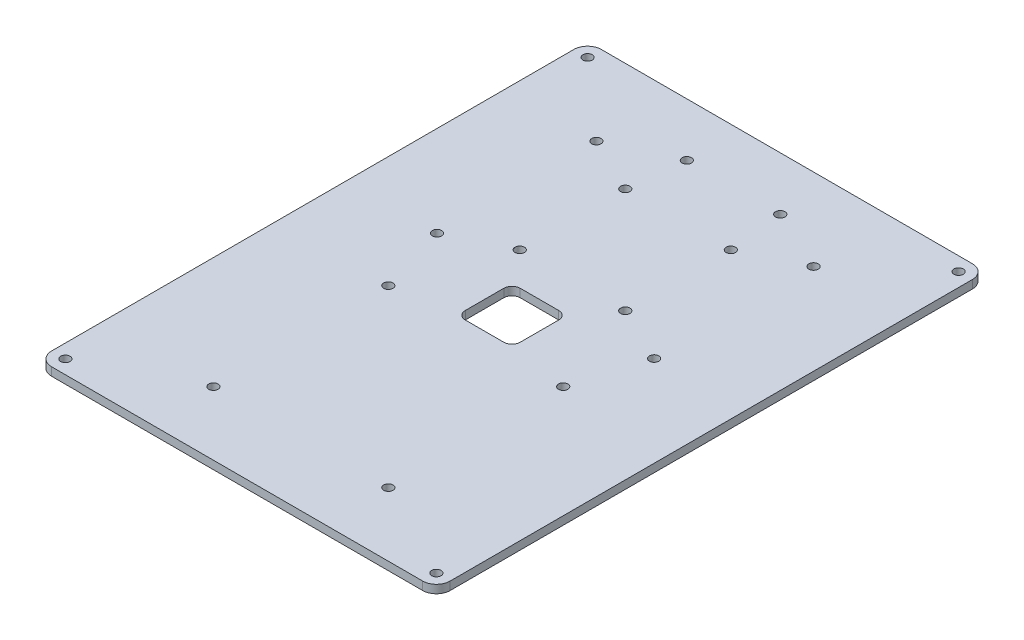
ISO-10303-21;
HEADER;
FILE_DESCRIPTION(('STEP AP214'),'2;1');
FILE_NAME('part.step','',(''),(''),'','','');
FILE_SCHEMA(('AUTOMOTIVE_DESIGN { 1 0 10303 214 1 1 1 1 }'));
ENDSEC;
DATA;
#1=APPLICATION_CONTEXT('core data for automotive mechanical design processes');
#2=APPLICATION_PROTOCOL_DEFINITION('international standard','automotive_design',2000,#1);
#3=PRODUCT_CONTEXT('',#1,'mechanical');
#4=PRODUCT('Part','Part','',(#3));
#5=PRODUCT_RELATED_PRODUCT_CATEGORY('part','',(#4));
#6=PRODUCT_DEFINITION_FORMATION('','',#4);
#7=PRODUCT_DEFINITION_CONTEXT('part definition',#1,'design');
#8=PRODUCT_DEFINITION('design','',#6,#7);
#9=PRODUCT_DEFINITION_SHAPE('','',#8);
#10=(LENGTH_UNIT() NAMED_UNIT(*) SI_UNIT(.MILLI.,.METRE.));
#11=(NAMED_UNIT(*) PLANE_ANGLE_UNIT() SI_UNIT($,.RADIAN.));
#12=(NAMED_UNIT(*) SI_UNIT($,.STERADIAN.) SOLID_ANGLE_UNIT());
#13=UNCERTAINTY_MEASURE_WITH_UNIT(LENGTH_MEASURE(1.E-05),#10,'distance_accuracy_value','');
#14=(GEOMETRIC_REPRESENTATION_CONTEXT(3) GLOBAL_UNCERTAINTY_ASSIGNED_CONTEXT((#13)) GLOBAL_UNIT_ASSIGNED_CONTEXT((#10,
#11,#12)) REPRESENTATION_CONTEXT('',''));
#15=CARTESIAN_POINT('',(0.,0.,0.));
#16=DIRECTION('',(0.,0.,1.));
#17=DIRECTION('',(1.,0.,0.));
#18=AXIS2_PLACEMENT_3D('',#15,#16,#17);
#19=CARTESIAN_POINT('',(-67.5,3.,95.));
#20=DIRECTION('',(0.,-1.,0.));
#21=DIRECTION('',(0.,0.,-1.));
#22=AXIS2_PLACEMENT_3D('',#19,#20,#21);
#23=CYLINDRICAL_SURFACE('',#22,5.);
#24=CARTESIAN_POINT('',(-67.5,0.,95.));
#25=DIRECTION('',(0.,1.,0.));
#26=DIRECTION('',(0.,0.,1.));
#27=AXIS2_PLACEMENT_3D('',#24,#25,#26);
#28=CIRCLE('',#27,5.);
#29=CARTESIAN_POINT('',(-67.5,0.,100.));
#30=VERTEX_POINT('',#29);
#31=CARTESIAN_POINT('',(-72.5,0.,95.));
#32=VERTEX_POINT('',#31);
#33=EDGE_CURVE('E305',#30,#32,#28,.F.);
#34=ORIENTED_EDGE('',*,*,#33,.F.);
#35=DIRECTION('',(0.,-1.,0.));
#36=VECTOR('',#35,1.);
#37=CARTESIAN_POINT('',(-67.5,3.,100.));
#38=LINE('',#37,#36);
#39=CARTESIAN_POINT('',(-67.5,3.,100.));
#40=VERTEX_POINT('',#39);
#41=EDGE_CURVE('E11',#40,#30,#38,.T.);
#42=ORIENTED_EDGE('',*,*,#41,.F.);
#43=CARTESIAN_POINT('',(-67.5,3.,95.));
#44=DIRECTION('',(0.,1.,0.));
#45=DIRECTION('',(0.,0.,1.));
#46=AXIS2_PLACEMENT_3D('',#43,#44,#45);
#47=CIRCLE('',#46,5.);
#48=CARTESIAN_POINT('',(-72.5,3.,95.));
#49=VERTEX_POINT('',#48);
#50=EDGE_CURVE('E436',#40,#49,#47,.F.);
#51=ORIENTED_EDGE('',*,*,#50,.T.);
#52=DIRECTION('',(0.,-1.,0.));
#53=VECTOR('',#52,1.);
#54=CARTESIAN_POINT('',(-72.5,3.,95.));
#55=LINE('',#54,#53);
#56=EDGE_CURVE('E65',#49,#32,#55,.T.);
#57=ORIENTED_EDGE('',*,*,#56,.T.);
#58=EDGE_LOOP('',(#34,#42,#51,#57));
#59=FACE_BOUND('',#58,.T.);
#60=ADVANCED_FACE('F45',(#59),#23,.T.);
#61=CARTESIAN_POINT('',(0.,3.,100.));
#62=DIRECTION('',(0.,0.,-1.));
#63=DIRECTION('',(-1.,0.,0.));
#64=AXIS2_PLACEMENT_3D('',#61,#62,#63);
#65=PLANE('',#64);
#66=DIRECTION('',(1.,0.,0.));
#67=VECTOR('',#66,1.);
#68=CARTESIAN_POINT('',(0.,0.,100.));
#69=LINE('',#68,#67);
#70=CARTESIAN_POINT('',(67.5,0.,100.));
#71=VERTEX_POINT('',#70);
#72=EDGE_CURVE('E308',#30,#71,#69,.T.);
#73=ORIENTED_EDGE('',*,*,#72,.T.);
#74=DIRECTION('',(0.,-1.,0.));
#75=VECTOR('',#74,1.);
#76=CARTESIAN_POINT('',(67.5,3.,100.));
#77=LINE('',#76,#75);
#78=CARTESIAN_POINT('',(67.5,3.,100.));
#79=VERTEX_POINT('',#78);
#80=EDGE_CURVE('E56',#79,#71,#77,.T.);
#81=ORIENTED_EDGE('',*,*,#80,.F.);
#82=DIRECTION('',(1.,0.,0.));
#83=VECTOR('',#82,1.);
#84=CARTESIAN_POINT('',(0.,3.,100.));
#85=LINE('',#84,#83);
#86=EDGE_CURVE('E439',#40,#79,#85,.T.);
#87=ORIENTED_EDGE('',*,*,#86,.F.);
#88=ORIENTED_EDGE('',*,*,#41,.T.);
#89=EDGE_LOOP('',(#73,#81,#87,#88));
#90=FACE_BOUND('',#89,.T.);
#91=ADVANCED_FACE('F469',(#90),#65,.F.);
#92=CARTESIAN_POINT('',(67.5,3.,95.));
#93=DIRECTION('',(0.,-1.,0.));
#94=DIRECTION('',(0.,0.,-1.));
#95=AXIS2_PLACEMENT_3D('',#92,#93,#94);
#96=CYLINDRICAL_SURFACE('',#95,5.);
#97=CARTESIAN_POINT('',(67.5,0.,95.));
#98=DIRECTION('',(0.,1.,0.));
#99=DIRECTION('',(0.,0.,1.));
#100=AXIS2_PLACEMENT_3D('',#97,#98,#99);
#101=CIRCLE('',#100,5.);
#102=CARTESIAN_POINT('',(72.5,0.,95.));
#103=VERTEX_POINT('',#102);
#104=EDGE_CURVE('E312',#71,#103,#101,.T.);
#105=ORIENTED_EDGE('',*,*,#104,.T.);
#106=DIRECTION('',(0.,-1.,0.));
#107=VECTOR('',#106,1.);
#108=CARTESIAN_POINT('',(72.5,3.,95.));
#109=LINE('',#108,#107);
#110=CARTESIAN_POINT('',(72.5,3.,95.));
#111=VERTEX_POINT('',#110);
#112=EDGE_CURVE('E344',#111,#103,#109,.T.);
#113=ORIENTED_EDGE('',*,*,#112,.F.);
#114=CARTESIAN_POINT('',(67.5,3.,95.));
#115=DIRECTION('',(0.,1.,0.));
#116=DIRECTION('',(0.,0.,1.));
#117=AXIS2_PLACEMENT_3D('',#114,#115,#116);
#118=CIRCLE('',#117,5.);
#119=EDGE_CURVE('E443',#79,#111,#118,.T.);
#120=ORIENTED_EDGE('',*,*,#119,.F.);
#121=ORIENTED_EDGE('',*,*,#80,.T.);
#122=EDGE_LOOP('',(#105,#113,#120,#121));
#123=FACE_BOUND('',#122,.T.);
#124=ADVANCED_FACE('F474',(#123),#96,.T.);
#125=CARTESIAN_POINT('',(72.5,3.,0.));
#126=DIRECTION('',(-1.,0.,0.));
#127=DIRECTION('',(0.,0.,1.));
#128=AXIS2_PLACEMENT_3D('',#125,#126,#127);
#129=PLANE('',#128);
#130=DIRECTION('',(0.,0.,-1.));
#131=VECTOR('',#130,1.);
#132=CARTESIAN_POINT('',(72.5,0.,0.));
#133=LINE('',#132,#131);
#134=CARTESIAN_POINT('',(72.5,0.,-95.));
#135=VERTEX_POINT('',#134);
#136=EDGE_CURVE('E316',#103,#135,#133,.T.);
#137=ORIENTED_EDGE('',*,*,#136,.T.);
#138=DIRECTION('',(0.,-1.,0.));
#139=VECTOR('',#138,1.);
#140=CARTESIAN_POINT('',(72.5,3.,-95.));
#141=LINE('',#140,#139);
#142=CARTESIAN_POINT('',(72.5,3.,-95.));
#143=VERTEX_POINT('',#142);
#144=EDGE_CURVE('E340',#143,#135,#141,.T.);
#145=ORIENTED_EDGE('',*,*,#144,.F.);
#146=DIRECTION('',(0.,0.,-1.));
#147=VECTOR('',#146,1.);
#148=CARTESIAN_POINT('',(72.5,3.,0.));
#149=LINE('',#148,#147);
#150=EDGE_CURVE('E194',#111,#143,#149,.T.);
#151=ORIENTED_EDGE('',*,*,#150,.F.);
#152=ORIENTED_EDGE('',*,*,#112,.T.);
#153=EDGE_LOOP('',(#137,#145,#151,#152));
#154=FACE_BOUND('',#153,.T.);
#155=ADVANCED_FACE('F450',(#154),#129,.F.);
#156=CARTESIAN_POINT('',(67.5,3.,-95.));
#157=DIRECTION('',(0.,-1.,0.));
#158=DIRECTION('',(0.,0.,-1.));
#159=AXIS2_PLACEMENT_3D('',#156,#157,#158);
#160=CYLINDRICAL_SURFACE('',#159,5.);
#161=CARTESIAN_POINT('',(67.5,0.,-95.));
#162=DIRECTION('',(0.,1.,0.));
#163=DIRECTION('',(0.,0.,1.));
#164=AXIS2_PLACEMENT_3D('',#161,#162,#163);
#165=CIRCLE('',#164,5.);
#166=CARTESIAN_POINT('',(67.5,0.,-100.));
#167=VERTEX_POINT('',#166);
#168=EDGE_CURVE('E320',#135,#167,#165,.T.);
#169=ORIENTED_EDGE('',*,*,#168,.T.);
#170=DIRECTION('',(0.,-1.,0.));
#171=VECTOR('',#170,1.);
#172=CARTESIAN_POINT('',(67.5,3.,-100.));
#173=LINE('',#172,#171);
#174=CARTESIAN_POINT('',(67.5,3.,-100.));
#175=VERTEX_POINT('',#174);
#176=EDGE_CURVE('E177',#175,#167,#173,.T.);
#177=ORIENTED_EDGE('',*,*,#176,.F.);
#178=CARTESIAN_POINT('',(67.5,3.,-95.));
#179=DIRECTION('',(0.,1.,0.));
#180=DIRECTION('',(0.,0.,1.));
#181=AXIS2_PLACEMENT_3D('',#178,#179,#180);
#182=CIRCLE('',#181,5.);
#183=EDGE_CURVE('E189',#143,#175,#182,.T.);
#184=ORIENTED_EDGE('',*,*,#183,.F.);
#185=ORIENTED_EDGE('',*,*,#144,.T.);
#186=EDGE_LOOP('',(#169,#177,#184,#185));
#187=FACE_BOUND('',#186,.T.);
#188=ADVANCED_FACE('F452',(#187),#160,.T.);
#189=CARTESIAN_POINT('',(0.,3.,-100.));
#190=DIRECTION('',(0.,0.,-1.));
#191=DIRECTION('',(-1.,0.,0.));
#192=AXIS2_PLACEMENT_3D('',#189,#190,#191);
#193=PLANE('',#192);
#194=DIRECTION('',(1.,0.,0.));
#195=VECTOR('',#194,1.);
#196=CARTESIAN_POINT('',(0.,0.,-100.));
#197=LINE('',#196,#195);
#198=CARTESIAN_POINT('',(-67.5,0.,-100.));
#199=VERTEX_POINT('',#198);
#200=EDGE_CURVE('E173',#199,#167,#197,.T.);
#201=ORIENTED_EDGE('',*,*,#200,.F.);
#202=DIRECTION('',(0.,-1.,0.));
#203=VECTOR('',#202,1.);
#204=CARTESIAN_POINT('',(-67.5,3.,-100.));
#205=LINE('',#204,#203);
#206=CARTESIAN_POINT('',(-67.5,3.,-100.));
#207=VERTEX_POINT('',#206);
#208=EDGE_CURVE('E167',#207,#199,#205,.T.);
#209=ORIENTED_EDGE('',*,*,#208,.F.);
#210=DIRECTION('',(1.,0.,0.));
#211=VECTOR('',#210,1.);
#212=CARTESIAN_POINT('',(0.,3.,-100.));
#213=LINE('',#212,#211);
#214=EDGE_CURVE('E171',#207,#175,#213,.T.);
#215=ORIENTED_EDGE('',*,*,#214,.T.);
#216=ORIENTED_EDGE('',*,*,#176,.T.);
#217=EDGE_LOOP('',(#201,#209,#215,#216));
#218=FACE_BOUND('',#217,.T.);
#219=ADVANCED_FACE('F169',(#218),#193,.T.);
#220=CARTESIAN_POINT('',(-67.5,3.,-95.));
#221=DIRECTION('',(0.,-1.,0.));
#222=DIRECTION('',(0.,0.,-1.));
#223=AXIS2_PLACEMENT_3D('',#220,#221,#222);
#224=CYLINDRICAL_SURFACE('',#223,5.);
#225=CARTESIAN_POINT('',(-67.5,0.,-95.));
#226=DIRECTION('',(0.,1.,0.));
#227=DIRECTION('',(0.,0.,1.));
#228=AXIS2_PLACEMENT_3D('',#225,#226,#227);
#229=CIRCLE('',#228,5.);
#230=CARTESIAN_POINT('',(-72.5,0.,-95.));
#231=VERTEX_POINT('',#230);
#232=EDGE_CURVE('E326',#199,#231,#229,.T.);
#233=ORIENTED_EDGE('',*,*,#232,.T.);
#234=DIRECTION('',(0.,-1.,0.));
#235=VECTOR('',#234,1.);
#236=CARTESIAN_POINT('',(-72.5,3.,-95.));
#237=LINE('',#236,#235);
#238=CARTESIAN_POINT('',(-72.5,3.,-95.));
#239=VERTEX_POINT('',#238);
#240=EDGE_CURVE('E115',#239,#231,#237,.T.);
#241=ORIENTED_EDGE('',*,*,#240,.F.);
#242=CARTESIAN_POINT('',(-67.5,3.,-95.));
#243=DIRECTION('',(0.,1.,0.));
#244=DIRECTION('',(0.,0.,1.));
#245=AXIS2_PLACEMENT_3D('',#242,#243,#244);
#246=CIRCLE('',#245,5.);
#247=EDGE_CURVE('E179',#207,#239,#246,.T.);
#248=ORIENTED_EDGE('',*,*,#247,.F.);
#249=ORIENTED_EDGE('',*,*,#208,.T.);
#250=EDGE_LOOP('',(#233,#241,#248,#249));
#251=FACE_BOUND('',#250,.T.);
#252=ADVANCED_FACE('F180',(#251),#224,.T.);
#253=CARTESIAN_POINT('',(-7.,3.,7.));
#254=DIRECTION('',(0.,-1.,0.));
#255=DIRECTION('',(0.,0.,-1.));
#256=AXIS2_PLACEMENT_3D('',#253,#254,#255);
#257=CYLINDRICAL_SURFACE('',#256,3.);
#258=CARTESIAN_POINT('',(-7.,0.,7.));
#259=DIRECTION('',(0.,1.,0.));
#260=DIRECTION('',(0.,0.,1.));
#261=AXIS2_PLACEMENT_3D('',#258,#259,#260);
#262=CIRCLE('',#261,3.);
#263=CARTESIAN_POINT('',(-10.,0.,7.));
#264=VERTEX_POINT('',#263);
#265=CARTESIAN_POINT('',(-7.,0.,10.));
#266=VERTEX_POINT('',#265);
#267=EDGE_CURVE('E257',#264,#266,#262,.T.);
#268=ORIENTED_EDGE('',*,*,#267,.F.);
#269=DIRECTION('',(0.,-1.,0.));
#270=VECTOR('',#269,1.);
#271=CARTESIAN_POINT('',(-10.,3.,7.));
#272=LINE('',#271,#270);
#273=CARTESIAN_POINT('',(-10.,3.,7.));
#274=VERTEX_POINT('',#273);
#275=EDGE_CURVE('E49',#274,#264,#272,.T.);
#276=ORIENTED_EDGE('',*,*,#275,.F.);
#277=CARTESIAN_POINT('',(-7.,3.,7.));
#278=DIRECTION('',(0.,1.,0.));
#279=DIRECTION('',(0.,0.,1.));
#280=AXIS2_PLACEMENT_3D('',#277,#278,#279);
#281=CIRCLE('',#280,3.);
#282=CARTESIAN_POINT('',(-7.,3.,10.));
#283=VERTEX_POINT('',#282);
#284=EDGE_CURVE('E403',#274,#283,#281,.T.);
#285=ORIENTED_EDGE('',*,*,#284,.T.);
#286=DIRECTION('',(0.,-1.,0.));
#287=VECTOR('',#286,1.);
#288=CARTESIAN_POINT('',(-7.,3.,10.));
#289=LINE('',#288,#287);
#290=EDGE_CURVE('E200',#283,#266,#289,.T.);
#291=ORIENTED_EDGE('',*,*,#290,.T.);
#292=EDGE_LOOP('',(#268,#276,#285,#291));
#293=FACE_BOUND('',#292,.T.);
#294=ADVANCED_FACE('F379',(#293),#257,.F.);
#295=CARTESIAN_POINT('',(-10.,3.,0.));
#296=DIRECTION('',(1.,0.,0.));
#297=DIRECTION('',(0.,0.,-1.));
#298=AXIS2_PLACEMENT_3D('',#295,#296,#297);
#299=PLANE('',#298);
#300=DIRECTION('',(0.,0.,1.));
#301=VECTOR('',#300,1.);
#302=CARTESIAN_POINT('',(-10.,0.,0.));
#303=LINE('',#302,#301);
#304=CARTESIAN_POINT('',(-10.,0.,-7.));
#305=VERTEX_POINT('',#304);
#306=EDGE_CURVE('E261',#305,#264,#303,.T.);
#307=ORIENTED_EDGE('',*,*,#306,.F.);
#308=DIRECTION('',(0.,-1.,0.));
#309=VECTOR('',#308,1.);
#310=CARTESIAN_POINT('',(-10.,3.,-7.));
#311=LINE('',#310,#309);
#312=CARTESIAN_POINT('',(-10.,3.,-7.));
#313=VERTEX_POINT('',#312);
#314=EDGE_CURVE('E367',#313,#305,#311,.T.);
#315=ORIENTED_EDGE('',*,*,#314,.F.);
#316=DIRECTION('',(0.,0.,1.));
#317=VECTOR('',#316,1.);
#318=CARTESIAN_POINT('',(-10.,3.,0.));
#319=LINE('',#318,#317);
#320=EDGE_CURVE('E378',#313,#274,#319,.T.);
#321=ORIENTED_EDGE('',*,*,#320,.T.);
#322=ORIENTED_EDGE('',*,*,#275,.T.);
#323=EDGE_LOOP('',(#307,#315,#321,#322));
#324=FACE_BOUND('',#323,.T.);
#325=ADVANCED_FACE('F376',(#324),#299,.T.);
#326=CARTESIAN_POINT('',(-7.,3.,-7.));
#327=DIRECTION('',(0.,-1.,0.));
#328=DIRECTION('',(0.,0.,-1.));
#329=AXIS2_PLACEMENT_3D('',#326,#327,#328);
#330=CYLINDRICAL_SURFACE('',#329,3.);
#331=CARTESIAN_POINT('',(-7.,0.,-7.));
#332=DIRECTION('',(0.,1.,0.));
#333=DIRECTION('',(0.,0.,1.));
#334=AXIS2_PLACEMENT_3D('',#331,#332,#333);
#335=CIRCLE('',#334,3.);
#336=CARTESIAN_POINT('',(-7.,0.,-10.));
#337=VERTEX_POINT('',#336);
#338=EDGE_CURVE('E265',#337,#305,#335,.T.);
#339=ORIENTED_EDGE('',*,*,#338,.F.);
#340=DIRECTION('',(0.,-1.,0.));
#341=VECTOR('',#340,1.);
#342=CARTESIAN_POINT('',(-7.,3.,-10.));
#343=LINE('',#342,#341);
#344=CARTESIAN_POINT('',(-7.,3.,-10.));
#345=VERTEX_POINT('',#344);
#346=EDGE_CURVE('E365',#345,#337,#343,.T.);
#347=ORIENTED_EDGE('',*,*,#346,.F.);
#348=CARTESIAN_POINT('',(-7.,3.,-7.));
#349=DIRECTION('',(0.,1.,0.));
#350=DIRECTION('',(0.,0.,1.));
#351=AXIS2_PLACEMENT_3D('',#348,#349,#350);
#352=CIRCLE('',#351,3.);
#353=EDGE_CURVE('E388',#345,#313,#352,.T.);
#354=ORIENTED_EDGE('',*,*,#353,.T.);
#355=ORIENTED_EDGE('',*,*,#314,.T.);
#356=EDGE_LOOP('',(#339,#347,#354,#355));
#357=FACE_BOUND('',#356,.T.);
#358=ADVANCED_FACE('F385',(#357),#330,.F.);
#359=CARTESIAN_POINT('',(0.,3.,-10.));
#360=DIRECTION('',(0.,0.,-1.));
#361=DIRECTION('',(-1.,0.,0.));
#362=AXIS2_PLACEMENT_3D('',#359,#360,#361);
#363=PLANE('',#362);
#364=DIRECTION('',(1.,0.,0.));
#365=VECTOR('',#364,1.);
#366=CARTESIAN_POINT('',(0.,0.,-10.));
#367=LINE('',#366,#365);
#368=CARTESIAN_POINT('',(7.,0.,-10.));
#369=VERTEX_POINT('',#368);
#370=EDGE_CURVE('E269',#337,#369,#367,.T.);
#371=ORIENTED_EDGE('',*,*,#370,.T.);
#372=DIRECTION('',(0.,-1.,0.));
#373=VECTOR('',#372,1.);
#374=CARTESIAN_POINT('',(7.,3.,-10.));
#375=LINE('',#374,#373);
#376=CARTESIAN_POINT('',(7.,3.,-10.));
#377=VERTEX_POINT('',#376);
#378=EDGE_CURVE('E362',#377,#369,#375,.T.);
#379=ORIENTED_EDGE('',*,*,#378,.F.);
#380=DIRECTION('',(1.,0.,0.));
#381=VECTOR('',#380,1.);
#382=CARTESIAN_POINT('',(0.,3.,-10.));
#383=LINE('',#382,#381);
#384=EDGE_CURVE('E391',#345,#377,#383,.T.);
#385=ORIENTED_EDGE('',*,*,#384,.F.);
#386=ORIENTED_EDGE('',*,*,#346,.T.);
#387=EDGE_LOOP('',(#371,#379,#385,#386));
#388=FACE_BOUND('',#387,.T.);
#389=ADVANCED_FACE('F392',(#388),#363,.F.);
#390=CARTESIAN_POINT('',(7.,3.,-7.));
#391=DIRECTION('',(0.,-1.,0.));
#392=DIRECTION('',(0.,0.,-1.));
#393=AXIS2_PLACEMENT_3D('',#390,#391,#392);
#394=CYLINDRICAL_SURFACE('',#393,3.);
#395=CARTESIAN_POINT('',(7.,0.,-7.));
#396=DIRECTION('',(0.,1.,0.));
#397=DIRECTION('',(0.,0.,1.));
#398=AXIS2_PLACEMENT_3D('',#395,#396,#397);
#399=CIRCLE('',#398,3.);
#400=CARTESIAN_POINT('',(10.,0.,-7.));
#401=VERTEX_POINT('',#400);
#402=EDGE_CURVE('E273',#401,#369,#399,.T.);
#403=ORIENTED_EDGE('',*,*,#402,.F.);
#404=DIRECTION('',(0.,-1.,0.));
#405=VECTOR('',#404,1.);
#406=CARTESIAN_POINT('',(10.,3.,-7.));
#407=LINE('',#406,#405);
#408=CARTESIAN_POINT('',(10.,3.,-7.));
#409=VERTEX_POINT('',#408);
#410=EDGE_CURVE('E359',#409,#401,#407,.T.);
#411=ORIENTED_EDGE('',*,*,#410,.F.);
#412=CARTESIAN_POINT('',(7.,3.,-7.));
#413=DIRECTION('',(0.,1.,0.));
#414=DIRECTION('',(0.,0.,1.));
#415=AXIS2_PLACEMENT_3D('',#412,#413,#414);
#416=CIRCLE('',#415,3.);
#417=EDGE_CURVE('E397',#409,#377,#416,.T.);
#418=ORIENTED_EDGE('',*,*,#417,.T.);
#419=ORIENTED_EDGE('',*,*,#378,.T.);
#420=EDGE_LOOP('',(#403,#411,#418,#419));
#421=FACE_BOUND('',#420,.T.);
#422=ADVANCED_FACE('F507',(#421),#394,.F.);
#423=CARTESIAN_POINT('',(10.,3.,0.));
#424=DIRECTION('',(1.,0.,0.));
#425=DIRECTION('',(0.,0.,-1.));
#426=AXIS2_PLACEMENT_3D('',#423,#424,#425);
#427=PLANE('',#426);
#428=DIRECTION('',(0.,0.,1.));
#429=VECTOR('',#428,1.);
#430=CARTESIAN_POINT('',(10.,0.,0.));
#431=LINE('',#430,#429);
#432=CARTESIAN_POINT('',(10.,0.,7.));
#433=VERTEX_POINT('',#432);
#434=EDGE_CURVE('E277',#401,#433,#431,.T.);
#435=ORIENTED_EDGE('',*,*,#434,.T.);
#436=DIRECTION('',(0.,-1.,0.));
#437=VECTOR('',#436,1.);
#438=CARTESIAN_POINT('',(10.,3.,7.));
#439=LINE('',#438,#437);
#440=CARTESIAN_POINT('',(10.,3.,7.));
#441=VERTEX_POINT('',#440);
#442=EDGE_CURVE('E356',#441,#433,#439,.T.);
#443=ORIENTED_EDGE('',*,*,#442,.F.);
#444=DIRECTION('',(0.,0.,1.));
#445=VECTOR('',#444,1.);
#446=CARTESIAN_POINT('',(10.,3.,0.));
#447=LINE('',#446,#445);
#448=EDGE_CURVE('E409',#409,#441,#447,.T.);
#449=ORIENTED_EDGE('',*,*,#448,.F.);
#450=ORIENTED_EDGE('',*,*,#410,.T.);
#451=EDGE_LOOP('',(#435,#443,#449,#450));
#452=FACE_BOUND('',#451,.T.);
#453=ADVANCED_FACE('F503',(#452),#427,.F.);
#454=CARTESIAN_POINT('',(7.,3.,7.));
#455=DIRECTION('',(0.,-1.,0.));
#456=DIRECTION('',(0.,0.,-1.));
#457=AXIS2_PLACEMENT_3D('',#454,#455,#456);
#458=CYLINDRICAL_SURFACE('',#457,3.);
#459=CARTESIAN_POINT('',(7.,0.,7.));
#460=DIRECTION('',(0.,1.,0.));
#461=DIRECTION('',(0.,0.,1.));
#462=AXIS2_PLACEMENT_3D('',#459,#460,#461);
#463=CIRCLE('',#462,3.);
#464=CARTESIAN_POINT('',(7.,0.,10.));
#465=VERTEX_POINT('',#464);
#466=EDGE_CURVE('E281',#465,#433,#463,.T.);
#467=ORIENTED_EDGE('',*,*,#466,.F.);
#468=DIRECTION('',(0.,-1.,0.));
#469=VECTOR('',#468,1.);
#470=CARTESIAN_POINT('',(7.,3.,10.));
#471=LINE('',#470,#469);
#472=CARTESIAN_POINT('',(7.,3.,10.));
#473=VERTEX_POINT('',#472);
#474=EDGE_CURVE('E353',#473,#465,#471,.T.);
#475=ORIENTED_EDGE('',*,*,#474,.F.);
#476=CARTESIAN_POINT('',(7.,3.,7.));
#477=DIRECTION('',(0.,1.,0.));
#478=DIRECTION('',(0.,0.,1.));
#479=AXIS2_PLACEMENT_3D('',#476,#477,#478);
#480=CIRCLE('',#479,3.);
#481=EDGE_CURVE('E412',#473,#441,#480,.T.);
#482=ORIENTED_EDGE('',*,*,#481,.T.);
#483=ORIENTED_EDGE('',*,*,#442,.T.);
#484=EDGE_LOOP('',(#467,#475,#482,#483));
#485=FACE_BOUND('',#484,.T.);
#486=ADVANCED_FACE('F483',(#485),#458,.F.);
#487=CARTESIAN_POINT('',(-67.5,3.,-95.));
#488=DIRECTION('',(0.,-1.,0.));
#489=DIRECTION('',(0.,0.,-1.));
#490=AXIS2_PLACEMENT_3D('',#487,#488,#489);
#491=CYLINDRICAL_SURFACE('',#490,1.7);
#492=CARTESIAN_POINT('',(-67.5,3.,-95.));
#493=DIRECTION('',(0.,1.,0.));
#494=DIRECTION('',(0.,0.,1.));
#495=AXIS2_PLACEMENT_3D('',#492,#493,#494);
#496=CIRCLE('',#495,1.7);
#497=CARTESIAN_POINT('',(-67.5,3.,-93.3));
#498=VERTEX_POINT('',#497);
#499=EDGE_CURVE('E432',#498,#498,#496,.T.);
#500=ORIENTED_EDGE('',*,*,#499,.T.);
#501=EDGE_LOOP('',(#500));
#502=FACE_BOUND('',#501,.T.);
#503=CARTESIAN_POINT('',(-67.5,0.,-95.));
#504=DIRECTION('',(0.,1.,0.));
#505=DIRECTION('',(0.,0.,1.));
#506=AXIS2_PLACEMENT_3D('',#503,#504,#505);
#507=CIRCLE('',#506,1.7);
#508=CARTESIAN_POINT('',(-67.5,0.,-93.3));
#509=VERTEX_POINT('',#508);
#510=EDGE_CURVE('E301',#509,#509,#507,.T.);
#511=ORIENTED_EDGE('',*,*,#510,.F.);
#512=EDGE_LOOP('',(#511));
#513=FACE_BOUND('',#512,.T.);
#514=ADVANCED_FACE('F479',(#502,#513),#491,.F.);
#515=CARTESIAN_POINT('',(67.5,3.,-95.));
#516=DIRECTION('',(0.,-1.,0.));
#517=DIRECTION('',(0.,0.,-1.));
#518=AXIS2_PLACEMENT_3D('',#515,#516,#517);
#519=CYLINDRICAL_SURFACE('',#518,1.7);
#520=CARTESIAN_POINT('',(67.5,3.,-95.));
#521=DIRECTION('',(0.,1.,0.));
#522=DIRECTION('',(0.,0.,1.));
#523=AXIS2_PLACEMENT_3D('',#520,#521,#522);
#524=CIRCLE('',#523,1.7);
#525=CARTESIAN_POINT('',(67.5,3.,-93.3));
#526=VERTEX_POINT('',#525);
#527=EDGE_CURVE('E428',#526,#526,#524,.T.);
#528=ORIENTED_EDGE('',*,*,#527,.T.);
#529=EDGE_LOOP('',(#528));
#530=FACE_BOUND('',#529,.T.);
#531=CARTESIAN_POINT('',(67.5,0.,-95.));
#532=DIRECTION('',(0.,1.,0.));
#533=DIRECTION('',(0.,0.,1.));
#534=AXIS2_PLACEMENT_3D('',#531,#532,#533);
#535=CIRCLE('',#534,1.7);
#536=CARTESIAN_POINT('',(67.5,0.,-93.3));
#537=VERTEX_POINT('',#536);
#538=EDGE_CURVE('E297',#537,#537,#535,.T.);
#539=ORIENTED_EDGE('',*,*,#538,.F.);
#540=EDGE_LOOP('',(#539));
#541=FACE_BOUND('',#540,.T.);
#542=ADVANCED_FACE('F482',(#530,#541),#519,.F.);
#543=CARTESIAN_POINT('',(67.500000000002,3.,95.));
#544=DIRECTION('',(0.,-1.,0.));
#545=DIRECTION('',(0.,0.,-1.));
#546=AXIS2_PLACEMENT_3D('',#543,#544,#545);
#547=CYLINDRICAL_SURFACE('',#546,1.7);
#548=CARTESIAN_POINT('',(67.500000000002,3.,95.));
#549=DIRECTION('',(0.,1.,0.));
#550=DIRECTION('',(0.,0.,1.));
#551=AXIS2_PLACEMENT_3D('',#548,#549,#550);
#552=CIRCLE('',#551,1.7);
#553=CARTESIAN_POINT('',(67.500000000002,3.,96.7));
#554=VERTEX_POINT('',#553);
#555=EDGE_CURVE('E424',#554,#554,#552,.T.);
#556=ORIENTED_EDGE('',*,*,#555,.T.);
#557=EDGE_LOOP('',(#556));
#558=FACE_BOUND('',#557,.T.);
#559=CARTESIAN_POINT('',(67.500000000002,0.,95.));
#560=DIRECTION('',(0.,1.,0.));
#561=DIRECTION('',(0.,0.,1.));
#562=AXIS2_PLACEMENT_3D('',#559,#560,#561);
#563=CIRCLE('',#562,1.7);
#564=CARTESIAN_POINT('',(67.500000000002,0.,96.7));
#565=VERTEX_POINT('',#564);
#566=EDGE_CURVE('E293',#565,#565,#563,.T.);
#567=ORIENTED_EDGE('',*,*,#566,.F.);
#568=EDGE_LOOP('',(#567));
#569=FACE_BOUND('',#568,.T.);
#570=ADVANCED_FACE('F487',(#558,#569),#547,.F.);
#571=CARTESIAN_POINT('',(-67.499999999998,3.,95.));
#572=DIRECTION('',(0.,-1.,0.));
#573=DIRECTION('',(0.,0.,-1.));
#574=AXIS2_PLACEMENT_3D('',#571,#572,#573);
#575=CYLINDRICAL_SURFACE('',#574,1.7);
#576=CARTESIAN_POINT('',(-67.499999999998,3.,95.));
#577=DIRECTION('',(0.,1.,0.));
#578=DIRECTION('',(0.,0.,1.));
#579=AXIS2_PLACEMENT_3D('',#576,#577,#578);
#580=CIRCLE('',#579,1.7);
#581=CARTESIAN_POINT('',(-67.499999999998,3.,96.7));
#582=VERTEX_POINT('',#581);
#583=EDGE_CURVE('E420',#582,#582,#580,.T.);
#584=ORIENTED_EDGE('',*,*,#583,.T.);
#585=EDGE_LOOP('',(#584));
#586=FACE_BOUND('',#585,.T.);
#587=CARTESIAN_POINT('',(-67.499999999998,0.,95.));
#588=DIRECTION('',(0.,1.,0.));
#589=DIRECTION('',(0.,0.,1.));
#590=AXIS2_PLACEMENT_3D('',#587,#588,#589);
#591=CIRCLE('',#590,1.7);
#592=CARTESIAN_POINT('',(-67.499999999998,0.,96.7));
#593=VERTEX_POINT('',#592);
#594=EDGE_CURVE('E289',#593,#593,#591,.T.);
#595=ORIENTED_EDGE('',*,*,#594,.F.);
#596=EDGE_LOOP('',(#595));
#597=FACE_BOUND('',#596,.T.);
#598=ADVANCED_FACE('F491',(#586,#597),#575,.F.);
#599=CARTESIAN_POINT('',(0.,3.,10.));
#600=DIRECTION('',(0.,0.,-1.));
#601=DIRECTION('',(-1.,0.,0.));
#602=AXIS2_PLACEMENT_3D('',#599,#600,#601);
#603=PLANE('',#602);
#604=DIRECTION('',(1.,0.,0.));
#605=VECTOR('',#604,1.);
#606=CARTESIAN_POINT('',(0.,0.,10.));
#607=LINE('',#606,#605);
#608=EDGE_CURVE('E285',#266,#465,#607,.T.);
#609=ORIENTED_EDGE('',*,*,#608,.F.);
#610=ORIENTED_EDGE('',*,*,#290,.F.);
#611=DIRECTION('',(1.,0.,0.));
#612=VECTOR('',#611,1.);
#613=CARTESIAN_POINT('',(0.,3.,10.));
#614=LINE('',#613,#612);
#615=EDGE_CURVE('E416',#283,#473,#614,.T.);
#616=ORIENTED_EDGE('',*,*,#615,.T.);
#617=ORIENTED_EDGE('',*,*,#474,.T.);
#618=EDGE_LOOP('',(#609,#610,#616,#617));
#619=FACE_BOUND('',#618,.T.);
#620=ADVANCED_FACE('F495',(#619),#603,.T.);
#621=CARTESIAN_POINT('',(-39.5,3.,-70.2154030428379));
#622=DIRECTION('',(0.,-1.,0.));
#623=DIRECTION('',(0.,0.,-1.));
#624=AXIS2_PLACEMENT_3D('',#621,#622,#623);
#625=CYLINDRICAL_SURFACE('',#624,1.7);
#626=CARTESIAN_POINT('',(-39.5,3.,-70.2154030428379));
#627=DIRECTION('',(0.,1.,0.));
#628=DIRECTION('',(0.,0.,1.));
#629=AXIS2_PLACEMENT_3D('',#626,#627,#628);
#630=CIRCLE('',#629,1.7);
#631=CARTESIAN_POINT('',(-39.5,3.,-68.5154030428379));
#632=VERTEX_POINT('',#631);
#633=EDGE_CURVE('E966',#632,#632,#630,.T.);
#634=ORIENTED_EDGE('',*,*,#633,.T.);
#635=EDGE_LOOP('',(#634));
#636=FACE_BOUND('',#635,.T.);
#637=CARTESIAN_POINT('',(-39.5,0.,-70.2154030428379));
#638=DIRECTION('',(0.,1.,0.));
#639=DIRECTION('',(0.,0.,1.));
#640=AXIS2_PLACEMENT_3D('',#637,#638,#639);
#641=CIRCLE('',#640,1.7);
#642=CARTESIAN_POINT('',(-39.5,0.,-68.5154030428379));
#643=VERTEX_POINT('',#642);
#644=EDGE_CURVE('E253',#643,#643,#641,.T.);
#645=ORIENTED_EDGE('',*,*,#644,.F.);
#646=EDGE_LOOP('',(#645));
#647=FACE_BOUND('',#646,.T.);
#648=ADVANCED_FACE('F499',(#636,#647),#625,.F.);
#649=CARTESIAN_POINT('',(-39.5,3.,-12.2154030428379));
#650=DIRECTION('',(0.,-1.,0.));
#651=DIRECTION('',(0.,0.,-1.));
#652=AXIS2_PLACEMENT_3D('',#649,#650,#651);
#653=CYLINDRICAL_SURFACE('',#652,1.7);
#654=CARTESIAN_POINT('',(-39.5,3.,-12.2154030428379));
#655=DIRECTION('',(0.,1.,0.));
#656=DIRECTION('',(0.,0.,1.));
#657=AXIS2_PLACEMENT_3D('',#654,#655,#656);
#658=CIRCLE('',#657,1.7);
#659=CARTESIAN_POINT('',(-39.5,3.,-10.5154030428379));
#660=VERTEX_POINT('',#659);
#661=EDGE_CURVE('E962',#660,#660,#658,.T.);
#662=ORIENTED_EDGE('',*,*,#661,.T.);
#663=EDGE_LOOP('',(#662));
#664=FACE_BOUND('',#663,.T.);
#665=CARTESIAN_POINT('',(-39.5,0.,-12.2154030428379));
#666=DIRECTION('',(0.,1.,0.));
#667=DIRECTION('',(0.,0.,1.));
#668=AXIS2_PLACEMENT_3D('',#665,#666,#667);
#669=CIRCLE('',#668,1.7);
#670=CARTESIAN_POINT('',(-39.5,0.,-10.5154030428379));
#671=VERTEX_POINT('',#670);
#672=EDGE_CURVE('E249',#671,#671,#669,.T.);
#673=ORIENTED_EDGE('',*,*,#672,.F.);
#674=EDGE_LOOP('',(#673));
#675=FACE_BOUND('',#674,.T.);
#676=ADVANCED_FACE('F522',(#664,#675),#653,.F.);
#677=CARTESIAN_POINT('',(39.5,3.,-12.2154030428379));
#678=DIRECTION('',(0.,-1.,0.));
#679=DIRECTION('',(0.,0.,-1.));
#680=AXIS2_PLACEMENT_3D('',#677,#678,#679);
#681=CYLINDRICAL_SURFACE('',#680,1.7);
#682=CARTESIAN_POINT('',(39.5,3.,-12.2154030428379));
#683=DIRECTION('',(0.,1.,0.));
#684=DIRECTION('',(0.,0.,1.));
#685=AXIS2_PLACEMENT_3D('',#682,#683,#684);
#686=CIRCLE('',#685,1.7);
#687=CARTESIAN_POINT('',(39.5,3.,-10.5154030428379));
#688=VERTEX_POINT('',#687);
#689=EDGE_CURVE('E958',#688,#688,#686,.T.);
#690=ORIENTED_EDGE('',*,*,#689,.T.);
#691=EDGE_LOOP('',(#690));
#692=FACE_BOUND('',#691,.T.);
#693=CARTESIAN_POINT('',(39.5,0.,-12.2154030428379));
#694=DIRECTION('',(0.,1.,0.));
#695=DIRECTION('',(0.,0.,1.));
#696=AXIS2_PLACEMENT_3D('',#693,#694,#695);
#697=CIRCLE('',#696,1.7);
#698=CARTESIAN_POINT('',(39.5,0.,-10.5154030428379));
#699=VERTEX_POINT('',#698);
#700=EDGE_CURVE('E245',#699,#699,#697,.T.);
#701=ORIENTED_EDGE('',*,*,#700,.F.);
#702=EDGE_LOOP('',(#701));
#703=FACE_BOUND('',#702,.T.);
#704=ADVANCED_FACE('F526',(#692,#703),#681,.F.);
#705=CARTESIAN_POINT('',(39.5,3.,-70.2154030428379));
#706=DIRECTION('',(0.,-1.,0.));
#707=DIRECTION('',(0.,0.,-1.));
#708=AXIS2_PLACEMENT_3D('',#705,#706,#707);
#709=CYLINDRICAL_SURFACE('',#708,1.7);
#710=CARTESIAN_POINT('',(39.5,3.,-70.2154030428379));
#711=DIRECTION('',(0.,1.,0.));
#712=DIRECTION('',(0.,0.,1.));
#713=AXIS2_PLACEMENT_3D('',#710,#711,#712);
#714=CIRCLE('',#713,1.7);
#715=CARTESIAN_POINT('',(39.5,3.,-68.5154030428379));
#716=VERTEX_POINT('',#715);
#717=EDGE_CURVE('E954',#716,#716,#714,.T.);
#718=ORIENTED_EDGE('',*,*,#717,.T.);
#719=EDGE_LOOP('',(#718));
#720=FACE_BOUND('',#719,.T.);
#721=CARTESIAN_POINT('',(39.5,0.,-70.2154030428379));
#722=DIRECTION('',(0.,1.,0.));
#723=DIRECTION('',(0.,0.,1.));
#724=AXIS2_PLACEMENT_3D('',#721,#722,#723);
#725=CIRCLE('',#724,1.7);
#726=CARTESIAN_POINT('',(39.5,0.,-68.5154030428379));
#727=VERTEX_POINT('',#726);
#728=EDGE_CURVE('E241',#727,#727,#725,.T.);
#729=ORIENTED_EDGE('',*,*,#728,.F.);
#730=EDGE_LOOP('',(#729));
#731=FACE_BOUND('',#730,.T.);
#732=ADVANCED_FACE('F530',(#720,#731),#709,.F.);
#733=CARTESIAN_POINT('',(-17.,3.,-80.6100042638106));
#734=DIRECTION('',(0.,-1.,0.));
#735=DIRECTION('',(0.,0.,-1.));
#736=AXIS2_PLACEMENT_3D('',#733,#734,#735);
#737=CYLINDRICAL_SURFACE('',#736,1.7);
#738=CARTESIAN_POINT('',(-17.,3.,-80.6100042638106));
#739=DIRECTION('',(0.,1.,0.));
#740=DIRECTION('',(0.,0.,1.));
#741=AXIS2_PLACEMENT_3D('',#738,#739,#740);
#742=CIRCLE('',#741,1.7);
#743=CARTESIAN_POINT('',(-17.,3.,-78.9100042638106));
#744=VERTEX_POINT('',#743);
#745=EDGE_CURVE('E950',#744,#744,#742,.T.);
#746=ORIENTED_EDGE('',*,*,#745,.T.);
#747=EDGE_LOOP('',(#746));
#748=FACE_BOUND('',#747,.T.);
#749=CARTESIAN_POINT('',(-17.,0.,-80.6100042638106));
#750=DIRECTION('',(0.,1.,0.));
#751=DIRECTION('',(0.,0.,1.));
#752=AXIS2_PLACEMENT_3D('',#749,#750,#751);
#753=CIRCLE('',#752,1.7);
#754=CARTESIAN_POINT('',(-17.,0.,-78.9100042638106));
#755=VERTEX_POINT('',#754);
#756=EDGE_CURVE('E237',#755,#755,#753,.T.);
#757=ORIENTED_EDGE('',*,*,#756,.F.);
#758=EDGE_LOOP('',(#757));
#759=FACE_BOUND('',#758,.T.);
#760=ADVANCED_FACE('F534',(#748,#759),#737,.F.);
#761=CARTESIAN_POINT('',(17.,3.,-80.6100042638106));
#762=DIRECTION('',(0.,-1.,0.));
#763=DIRECTION('',(0.,0.,-1.));
#764=AXIS2_PLACEMENT_3D('',#761,#762,#763);
#765=CYLINDRICAL_SURFACE('',#764,1.7);
#766=CARTESIAN_POINT('',(17.,3.,-80.6100042638106));
#767=DIRECTION('',(0.,1.,0.));
#768=DIRECTION('',(0.,0.,1.));
#769=AXIS2_PLACEMENT_3D('',#766,#767,#768);
#770=CIRCLE('',#769,1.7);
#771=CARTESIAN_POINT('',(17.,3.,-78.9100042638106));
#772=VERTEX_POINT('',#771);
#773=EDGE_CURVE('E946',#772,#772,#770,.T.);
#774=ORIENTED_EDGE('',*,*,#773,.T.);
#775=EDGE_LOOP('',(#774));
#776=FACE_BOUND('',#775,.T.);
#777=CARTESIAN_POINT('',(17.,0.,-80.6100042638106));
#778=DIRECTION('',(0.,1.,0.));
#779=DIRECTION('',(0.,0.,1.));
#780=AXIS2_PLACEMENT_3D('',#777,#778,#779);
#781=CIRCLE('',#780,1.7);
#782=CARTESIAN_POINT('',(17.,0.,-78.9100042638106));
#783=VERTEX_POINT('',#782);
#784=EDGE_CURVE('E233',#783,#783,#781,.T.);
#785=ORIENTED_EDGE('',*,*,#784,.F.);
#786=EDGE_LOOP('',(#785));
#787=FACE_BOUND('',#786,.T.);
#788=ADVANCED_FACE('F538',(#776,#787),#765,.F.);
#789=CARTESIAN_POINT('',(-31.8198051533946,3.,13.1801948466053));
#790=DIRECTION('',(0.,-1.,0.));
#791=DIRECTION('',(0.,0.,-1.));
#792=AXIS2_PLACEMENT_3D('',#789,#790,#791);
#793=CYLINDRICAL_SURFACE('',#792,1.7);
#794=CARTESIAN_POINT('',(-31.8198051533946,3.,13.1801948466053));
#795=DIRECTION('',(0.,1.,0.));
#796=DIRECTION('',(0.,0.,1.));
#797=AXIS2_PLACEMENT_3D('',#794,#795,#796);
#798=CIRCLE('',#797,1.7);
#799=CARTESIAN_POINT('',(-31.8198051533946,3.,14.8801948466053));
#800=VERTEX_POINT('',#799);
#801=EDGE_CURVE('E942',#800,#800,#798,.T.);
#802=ORIENTED_EDGE('',*,*,#801,.T.);
#803=EDGE_LOOP('',(#802));
#804=FACE_BOUND('',#803,.T.);
#805=CARTESIAN_POINT('',(-31.8198051533946,0.,13.1801948466053));
#806=DIRECTION('',(0.,1.,0.));
#807=DIRECTION('',(0.,0.,1.));
#808=AXIS2_PLACEMENT_3D('',#805,#806,#807);
#809=CIRCLE('',#808,1.7);
#810=CARTESIAN_POINT('',(-31.8198051533946,0.,14.8801948466053));
#811=VERTEX_POINT('',#810);
#812=EDGE_CURVE('E229',#811,#811,#809,.T.);
#813=ORIENTED_EDGE('',*,*,#812,.F.);
#814=EDGE_LOOP('',(#813));
#815=FACE_BOUND('',#814,.T.);
#816=ADVANCED_FACE('F542',(#804,#815),#793,.F.);
#817=CARTESIAN_POINT('',(31.8198051533948,3.,13.1801948466046));
#818=DIRECTION('',(0.,-1.,0.));
#819=DIRECTION('',(0.,0.,-1.));
#820=AXIS2_PLACEMENT_3D('',#817,#818,#819);
#821=CYLINDRICAL_SURFACE('',#820,1.7);
#822=CARTESIAN_POINT('',(31.8198051533948,3.,13.1801948466046));
#823=DIRECTION('',(0.,1.,0.));
#824=DIRECTION('',(0.,0.,1.));
#825=AXIS2_PLACEMENT_3D('',#822,#823,#824);
#826=CIRCLE('',#825,1.7);
#827=CARTESIAN_POINT('',(31.8198051533948,3.,14.8801948466046));
#828=VERTEX_POINT('',#827);
#829=EDGE_CURVE('E938',#828,#828,#826,.T.);
#830=ORIENTED_EDGE('',*,*,#829,.T.);
#831=EDGE_LOOP('',(#830));
#832=FACE_BOUND('',#831,.T.);
#833=CARTESIAN_POINT('',(31.8198051533948,0.,13.1801948466046));
#834=DIRECTION('',(0.,1.,0.));
#835=DIRECTION('',(0.,0.,1.));
#836=AXIS2_PLACEMENT_3D('',#833,#834,#835);
#837=CIRCLE('',#836,1.7);
#838=CARTESIAN_POINT('',(31.8198051533948,0.,14.8801948466046));
#839=VERTEX_POINT('',#838);
#840=EDGE_CURVE('E225',#839,#839,#837,.T.);
#841=ORIENTED_EDGE('',*,*,#840,.F.);
#842=EDGE_LOOP('',(#841));
#843=FACE_BOUND('',#842,.T.);
#844=ADVANCED_FACE('F546',(#832,#843),#821,.F.);
#845=CARTESIAN_POINT('',(31.8198051533952,3.,76.819805153394));
#846=DIRECTION('',(0.,-1.,0.));
#847=DIRECTION('',(0.,0.,-1.));
#848=AXIS2_PLACEMENT_3D('',#845,#846,#847);
#849=CYLINDRICAL_SURFACE('',#848,1.7);
#850=CARTESIAN_POINT('',(31.8198051533952,3.,76.819805153394));
#851=DIRECTION('',(0.,1.,0.));
#852=DIRECTION('',(0.,0.,1.));
#853=AXIS2_PLACEMENT_3D('',#850,#851,#852);
#854=CIRCLE('',#853,1.7);
#855=CARTESIAN_POINT('',(31.8198051533952,3.,78.519805153394));
#856=VERTEX_POINT('',#855);
#857=EDGE_CURVE('E934',#856,#856,#854,.T.);
#858=ORIENTED_EDGE('',*,*,#857,.T.);
#859=EDGE_LOOP('',(#858));
#860=FACE_BOUND('',#859,.T.);
#861=CARTESIAN_POINT('',(31.8198051533952,0.,76.819805153394));
#862=DIRECTION('',(0.,1.,0.));
#863=DIRECTION('',(0.,0.,1.));
#864=AXIS2_PLACEMENT_3D('',#861,#862,#863);
#865=CIRCLE('',#864,1.7);
#866=CARTESIAN_POINT('',(31.8198051533952,0.,78.519805153394));
#867=VERTEX_POINT('',#866);
#868=EDGE_CURVE('E221',#867,#867,#865,.T.);
#869=ORIENTED_EDGE('',*,*,#868,.F.);
#870=EDGE_LOOP('',(#869));
#871=FACE_BOUND('',#870,.T.);
#872=ADVANCED_FACE('F550',(#860,#871),#849,.F.);
#873=CARTESIAN_POINT('',(-31.8198051533941,3.,76.8198051533943));
#874=DIRECTION('',(0.,-1.,0.));
#875=DIRECTION('',(0.,0.,-1.));
#876=AXIS2_PLACEMENT_3D('',#873,#874,#875);
#877=CYLINDRICAL_SURFACE('',#876,1.70000000000001);
#878=CARTESIAN_POINT('',(-31.8198051533941,3.,76.8198051533943));
#879=DIRECTION('',(0.,1.,0.));
#880=DIRECTION('',(0.,0.,1.));
#881=AXIS2_PLACEMENT_3D('',#878,#879,#880);
#882=CIRCLE('',#881,1.70000000000001);
#883=CARTESIAN_POINT('',(-31.8198051533941,3.,78.5198051533943));
#884=VERTEX_POINT('',#883);
#885=EDGE_CURVE('E930',#884,#884,#882,.T.);
#886=ORIENTED_EDGE('',*,*,#885,.T.);
#887=EDGE_LOOP('',(#886));
#888=FACE_BOUND('',#887,.T.);
#889=CARTESIAN_POINT('',(-31.8198051533941,0.,76.8198051533943));
#890=DIRECTION('',(0.,1.,0.));
#891=DIRECTION('',(0.,0.,1.));
#892=AXIS2_PLACEMENT_3D('',#889,#890,#891);
#893=CIRCLE('',#892,1.70000000000001);
#894=CARTESIAN_POINT('',(-31.8198051533941,0.,78.5198051533943));
#895=VERTEX_POINT('',#894);
#896=EDGE_CURVE('E217',#895,#895,#893,.T.);
#897=ORIENTED_EDGE('',*,*,#896,.F.);
#898=EDGE_LOOP('',(#897));
#899=FACE_BOUND('',#898,.T.);
#900=ADVANCED_FACE('F554',(#888,#899),#877,.F.);
#901=CARTESIAN_POINT('',(-19.2,3.,-60.4154030428379));
#902=DIRECTION('',(0.,-1.,0.));
#903=DIRECTION('',(0.,0.,-1.));
#904=AXIS2_PLACEMENT_3D('',#901,#902,#903);
#905=CYLINDRICAL_SURFACE('',#904,1.7);
#906=CARTESIAN_POINT('',(-19.2,3.,-60.4154030428379));
#907=DIRECTION('',(0.,1.,0.));
#908=DIRECTION('',(0.,0.,1.));
#909=AXIS2_PLACEMENT_3D('',#906,#907,#908);
#910=CIRCLE('',#909,1.7);
#911=CARTESIAN_POINT('',(-19.2,3.,-58.7154030428379));
#912=VERTEX_POINT('',#911);
#913=EDGE_CURVE('E922',#912,#912,#910,.T.);
#914=ORIENTED_EDGE('',*,*,#913,.T.);
#915=EDGE_LOOP('',(#914));
#916=FACE_BOUND('',#915,.T.);
#917=CARTESIAN_POINT('',(-19.2,0.,-60.4154030428379));
#918=DIRECTION('',(0.,1.,0.));
#919=DIRECTION('',(0.,0.,1.));
#920=AXIS2_PLACEMENT_3D('',#917,#918,#919);
#921=CIRCLE('',#920,1.7);
#922=CARTESIAN_POINT('',(-19.2,0.,-58.7154030428379));
#923=VERTEX_POINT('',#922);
#924=EDGE_CURVE('E213',#923,#923,#921,.T.);
#925=ORIENTED_EDGE('',*,*,#924,.F.);
#926=EDGE_LOOP('',(#925));
#927=FACE_BOUND('',#926,.T.);
#928=ADVANCED_FACE('F558',(#916,#927),#905,.F.);
#929=CARTESIAN_POINT('',(19.2000000000001,3.,-60.4154030428384));
#930=DIRECTION('',(0.,-1.,0.));
#931=DIRECTION('',(0.,0.,-1.));
#932=AXIS2_PLACEMENT_3D('',#929,#930,#931);
#933=CYLINDRICAL_SURFACE('',#932,1.7);
#934=CARTESIAN_POINT('',(19.2000000000001,3.,-60.4154030428384));
#935=DIRECTION('',(0.,1.,0.));
#936=DIRECTION('',(0.,0.,1.));
#937=AXIS2_PLACEMENT_3D('',#934,#935,#936);
#938=CIRCLE('',#937,1.7);
#939=CARTESIAN_POINT('',(19.2000000000001,3.,-58.7154030428384));
#940=VERTEX_POINT('',#939);
#941=EDGE_CURVE('E917',#940,#940,#938,.T.);
#942=ORIENTED_EDGE('',*,*,#941,.T.);
#943=EDGE_LOOP('',(#942));
#944=FACE_BOUND('',#943,.T.);
#945=CARTESIAN_POINT('',(19.2000000000001,0.,-60.4154030428384));
#946=DIRECTION('',(0.,1.,0.));
#947=DIRECTION('',(0.,0.,1.));
#948=AXIS2_PLACEMENT_3D('',#945,#946,#947);
#949=CIRCLE('',#948,1.7);
#950=CARTESIAN_POINT('',(19.2000000000001,0.,-58.7154030428384));
#951=VERTEX_POINT('',#950);
#952=EDGE_CURVE('E209',#951,#951,#949,.T.);
#953=ORIENTED_EDGE('',*,*,#952,.F.);
#954=EDGE_LOOP('',(#953));
#955=FACE_BOUND('',#954,.T.);
#956=ADVANCED_FACE('F562',(#944,#955),#933,.F.);
#957=CARTESIAN_POINT('',(19.2000000000004,3.,-22.0154030428384));
#958=DIRECTION('',(0.,-1.,0.));
#959=DIRECTION('',(0.,0.,-1.));
#960=AXIS2_PLACEMENT_3D('',#957,#958,#959);
#961=CYLINDRICAL_SURFACE('',#960,1.7);
#962=CARTESIAN_POINT('',(19.2000000000004,3.,-22.0154030428384));
#963=DIRECTION('',(0.,1.,0.));
#964=DIRECTION('',(0.,0.,1.));
#965=AXIS2_PLACEMENT_3D('',#962,#963,#964);
#966=CIRCLE('',#965,1.7);
#967=CARTESIAN_POINT('',(19.2000000000004,3.,-20.3154030428384));
#968=VERTEX_POINT('',#967);
#969=EDGE_CURVE('E573',#968,#968,#966,.T.);
#970=ORIENTED_EDGE('',*,*,#969,.T.);
#971=EDGE_LOOP('',(#970));
#972=FACE_BOUND('',#971,.T.);
#973=CARTESIAN_POINT('',(19.2000000000004,0.,-22.0154030428384));
#974=DIRECTION('',(0.,1.,0.));
#975=DIRECTION('',(0.,0.,1.));
#976=AXIS2_PLACEMENT_3D('',#973,#974,#975);
#977=CIRCLE('',#976,1.7);
#978=CARTESIAN_POINT('',(19.2000000000004,0.,-20.3154030428384));
#979=VERTEX_POINT('',#978);
#980=EDGE_CURVE('E205',#979,#979,#977,.T.);
#981=ORIENTED_EDGE('',*,*,#980,.F.);
#982=EDGE_LOOP('',(#981));
#983=FACE_BOUND('',#982,.T.);
#984=ADVANCED_FACE('F464',(#972,#983),#961,.F.);
#985=CARTESIAN_POINT('',(-19.1999999999996,3.,-22.0154030428381));
#986=DIRECTION('',(0.,-1.,0.));
#987=DIRECTION('',(0.,0.,-1.));
#988=AXIS2_PLACEMENT_3D('',#985,#986,#987);
#989=CYLINDRICAL_SURFACE('',#988,1.7);
#990=CARTESIAN_POINT('',(-19.1999999999996,3.,-22.0154030428381));
#991=DIRECTION('',(0.,1.,0.));
#992=DIRECTION('',(0.,0.,1.));
#993=AXIS2_PLACEMENT_3D('',#990,#991,#992);
#994=CIRCLE('',#993,1.7);
#995=CARTESIAN_POINT('',(-19.1999999999996,3.,-20.3154030428381));
#996=VERTEX_POINT('',#995);
#997=EDGE_CURVE('E333',#996,#996,#994,.T.);
#998=ORIENTED_EDGE('',*,*,#997,.T.);
#999=EDGE_LOOP('',(#998));
#1000=FACE_BOUND('',#999,.T.);
#1001=CARTESIAN_POINT('',(-19.1999999999996,0.,-22.0154030428381));
#1002=DIRECTION('',(0.,1.,0.));
#1003=DIRECTION('',(0.,0.,1.));
#1004=AXIS2_PLACEMENT_3D('',#1001,#1002,#1003);
#1005=CIRCLE('',#1004,1.7);
#1006=CARTESIAN_POINT('',(-19.1999999999996,0.,-20.3154030428381));
#1007=VERTEX_POINT('',#1006);
#1008=EDGE_CURVE('E201',#1007,#1007,#1005,.T.);
#1009=ORIENTED_EDGE('',*,*,#1008,.F.);
#1010=EDGE_LOOP('',(#1009));
#1011=FACE_BOUND('',#1010,.T.);
#1012=ADVANCED_FACE('F47',(#1000,#1011),#989,.F.);
#1013=CARTESIAN_POINT('',(-72.5,3.,0.));
#1014=DIRECTION('',(-1.,0.,0.));
#1015=DIRECTION('',(0.,0.,1.));
#1016=AXIS2_PLACEMENT_3D('',#1013,#1014,#1015);
#1017=PLANE('',#1016);
#1018=DIRECTION('',(0.,0.,-1.));
#1019=VECTOR('',#1018,1.);
#1020=CARTESIAN_POINT('',(-72.5,0.,0.));
#1021=LINE('',#1020,#1019);
#1022=EDGE_CURVE('E329',#32,#231,#1021,.T.);
#1023=ORIENTED_EDGE('',*,*,#1022,.F.);
#1024=ORIENTED_EDGE('',*,*,#56,.F.);
#1025=DIRECTION('',(0.,0.,-1.));
#1026=VECTOR('',#1025,1.);
#1027=CARTESIAN_POINT('',(-72.5,3.,0.));
#1028=LINE('',#1027,#1026);
#1029=EDGE_CURVE('E184',#49,#239,#1028,.T.);
#1030=ORIENTED_EDGE('',*,*,#1029,.T.);
#1031=ORIENTED_EDGE('',*,*,#240,.T.);
#1032=EDGE_LOOP('',(#1023,#1024,#1030,#1031));
#1033=FACE_BOUND('',#1032,.T.);
#1034=ADVANCED_FACE('F455',(#1033),#1017,.T.);
#1035=CARTESIAN_POINT('',(0.,3.,0.));
#1036=DIRECTION('',(0.,1.,0.));
#1037=DIRECTION('',(0.,0.,1.));
#1038=AXIS2_PLACEMENT_3D('',#1035,#1036,#1037);
#1039=PLANE('',#1038);
#1040=ORIENTED_EDGE('',*,*,#997,.F.);
#1041=EDGE_LOOP('',(#1040));
#1042=FACE_BOUND('',#1041,.T.);
#1043=ORIENTED_EDGE('',*,*,#969,.F.);
#1044=EDGE_LOOP('',(#1043));
#1045=FACE_BOUND('',#1044,.T.);
#1046=ORIENTED_EDGE('',*,*,#941,.F.);
#1047=EDGE_LOOP('',(#1046));
#1048=FACE_BOUND('',#1047,.T.);
#1049=ORIENTED_EDGE('',*,*,#913,.F.);
#1050=EDGE_LOOP('',(#1049));
#1051=FACE_BOUND('',#1050,.T.);
#1052=ORIENTED_EDGE('',*,*,#885,.F.);
#1053=EDGE_LOOP('',(#1052));
#1054=FACE_BOUND('',#1053,.T.);
#1055=ORIENTED_EDGE('',*,*,#857,.F.);
#1056=EDGE_LOOP('',(#1055));
#1057=FACE_BOUND('',#1056,.T.);
#1058=ORIENTED_EDGE('',*,*,#829,.F.);
#1059=EDGE_LOOP('',(#1058));
#1060=FACE_BOUND('',#1059,.T.);
#1061=ORIENTED_EDGE('',*,*,#801,.F.);
#1062=EDGE_LOOP('',(#1061));
#1063=FACE_BOUND('',#1062,.T.);
#1064=ORIENTED_EDGE('',*,*,#773,.F.);
#1065=EDGE_LOOP('',(#1064));
#1066=FACE_BOUND('',#1065,.T.);
#1067=ORIENTED_EDGE('',*,*,#745,.F.);
#1068=EDGE_LOOP('',(#1067));
#1069=FACE_BOUND('',#1068,.T.);
#1070=ORIENTED_EDGE('',*,*,#717,.F.);
#1071=EDGE_LOOP('',(#1070));
#1072=FACE_BOUND('',#1071,.T.);
#1073=ORIENTED_EDGE('',*,*,#689,.F.);
#1074=EDGE_LOOP('',(#1073));
#1075=FACE_BOUND('',#1074,.T.);
#1076=ORIENTED_EDGE('',*,*,#661,.F.);
#1077=EDGE_LOOP('',(#1076));
#1078=FACE_BOUND('',#1077,.T.);
#1079=ORIENTED_EDGE('',*,*,#633,.F.);
#1080=EDGE_LOOP('',(#1079));
#1081=FACE_BOUND('',#1080,.T.);
#1082=ORIENTED_EDGE('',*,*,#284,.F.);
#1083=ORIENTED_EDGE('',*,*,#320,.F.);
#1084=ORIENTED_EDGE('',*,*,#353,.F.);
#1085=ORIENTED_EDGE('',*,*,#384,.T.);
#1086=ORIENTED_EDGE('',*,*,#417,.F.);
#1087=ORIENTED_EDGE('',*,*,#448,.T.);
#1088=ORIENTED_EDGE('',*,*,#481,.F.);
#1089=ORIENTED_EDGE('',*,*,#615,.F.);
#1090=EDGE_LOOP('',(#1082,#1083,#1084,#1085,#1086,#1087,#1088,#1089));
#1091=FACE_BOUND('',#1090,.T.);
#1092=ORIENTED_EDGE('',*,*,#583,.F.);
#1093=EDGE_LOOP('',(#1092));
#1094=FACE_BOUND('',#1093,.T.);
#1095=ORIENTED_EDGE('',*,*,#555,.F.);
#1096=EDGE_LOOP('',(#1095));
#1097=FACE_BOUND('',#1096,.T.);
#1098=ORIENTED_EDGE('',*,*,#527,.F.);
#1099=EDGE_LOOP('',(#1098));
#1100=FACE_BOUND('',#1099,.T.);
#1101=ORIENTED_EDGE('',*,*,#499,.F.);
#1102=EDGE_LOOP('',(#1101));
#1103=FACE_BOUND('',#1102,.T.);
#1104=ORIENTED_EDGE('',*,*,#50,.F.);
#1105=ORIENTED_EDGE('',*,*,#86,.T.);
#1106=ORIENTED_EDGE('',*,*,#119,.T.);
#1107=ORIENTED_EDGE('',*,*,#150,.T.);
#1108=ORIENTED_EDGE('',*,*,#183,.T.);
#1109=ORIENTED_EDGE('',*,*,#214,.F.);
#1110=ORIENTED_EDGE('',*,*,#247,.T.);
#1111=ORIENTED_EDGE('',*,*,#1029,.F.);
#1112=EDGE_LOOP('',(#1104,#1105,#1106,#1107,#1108,#1109,#1110,#1111));
#1113=FACE_BOUND('',#1112,.T.);
#1114=ADVANCED_FACE('F187',(#1042,#1045,#1048,#1051,#1054,#1057,#1060,#1063,#1066,#1069,#1072,
#1075,#1078,#1081,#1091,#1094,#1097,#1100,#1103,#1113),#1039,.T.);
#1115=CARTESIAN_POINT('',(0.,0.,0.));
#1116=DIRECTION('',(0.,1.,0.));
#1117=DIRECTION('',(0.,0.,1.));
#1118=AXIS2_PLACEMENT_3D('',#1115,#1116,#1117);
#1119=PLANE('',#1118);
#1120=ORIENTED_EDGE('',*,*,#1008,.T.);
#1121=EDGE_LOOP('',(#1120));
#1122=FACE_BOUND('',#1121,.T.);
#1123=ORIENTED_EDGE('',*,*,#980,.T.);
#1124=EDGE_LOOP('',(#1123));
#1125=FACE_BOUND('',#1124,.T.);
#1126=ORIENTED_EDGE('',*,*,#952,.T.);
#1127=EDGE_LOOP('',(#1126));
#1128=FACE_BOUND('',#1127,.T.);
#1129=ORIENTED_EDGE('',*,*,#924,.T.);
#1130=EDGE_LOOP('',(#1129));
#1131=FACE_BOUND('',#1130,.T.);
#1132=ORIENTED_EDGE('',*,*,#896,.T.);
#1133=EDGE_LOOP('',(#1132));
#1134=FACE_BOUND('',#1133,.T.);
#1135=ORIENTED_EDGE('',*,*,#868,.T.);
#1136=EDGE_LOOP('',(#1135));
#1137=FACE_BOUND('',#1136,.T.);
#1138=ORIENTED_EDGE('',*,*,#840,.T.);
#1139=EDGE_LOOP('',(#1138));
#1140=FACE_BOUND('',#1139,.T.);
#1141=ORIENTED_EDGE('',*,*,#812,.T.);
#1142=EDGE_LOOP('',(#1141));
#1143=FACE_BOUND('',#1142,.T.);
#1144=ORIENTED_EDGE('',*,*,#784,.T.);
#1145=EDGE_LOOP('',(#1144));
#1146=FACE_BOUND('',#1145,.T.);
#1147=ORIENTED_EDGE('',*,*,#756,.T.);
#1148=EDGE_LOOP('',(#1147));
#1149=FACE_BOUND('',#1148,.T.);
#1150=ORIENTED_EDGE('',*,*,#728,.T.);
#1151=EDGE_LOOP('',(#1150));
#1152=FACE_BOUND('',#1151,.T.);
#1153=ORIENTED_EDGE('',*,*,#700,.T.);
#1154=EDGE_LOOP('',(#1153));
#1155=FACE_BOUND('',#1154,.T.);
#1156=ORIENTED_EDGE('',*,*,#672,.T.);
#1157=EDGE_LOOP('',(#1156));
#1158=FACE_BOUND('',#1157,.T.);
#1159=ORIENTED_EDGE('',*,*,#644,.T.);
#1160=EDGE_LOOP('',(#1159));
#1161=FACE_BOUND('',#1160,.T.);
#1162=ORIENTED_EDGE('',*,*,#267,.T.);
#1163=ORIENTED_EDGE('',*,*,#608,.T.);
#1164=ORIENTED_EDGE('',*,*,#466,.T.);
#1165=ORIENTED_EDGE('',*,*,#434,.F.);
#1166=ORIENTED_EDGE('',*,*,#402,.T.);
#1167=ORIENTED_EDGE('',*,*,#370,.F.);
#1168=ORIENTED_EDGE('',*,*,#338,.T.);
#1169=ORIENTED_EDGE('',*,*,#306,.T.);
#1170=EDGE_LOOP('',(#1162,#1163,#1164,#1165,#1166,#1167,#1168,#1169));
#1171=FACE_BOUND('',#1170,.T.);
#1172=ORIENTED_EDGE('',*,*,#594,.T.);
#1173=EDGE_LOOP('',(#1172));
#1174=FACE_BOUND('',#1173,.T.);
#1175=ORIENTED_EDGE('',*,*,#566,.T.);
#1176=EDGE_LOOP('',(#1175));
#1177=FACE_BOUND('',#1176,.T.);
#1178=ORIENTED_EDGE('',*,*,#538,.T.);
#1179=EDGE_LOOP('',(#1178));
#1180=FACE_BOUND('',#1179,.T.);
#1181=ORIENTED_EDGE('',*,*,#510,.T.);
#1182=EDGE_LOOP('',(#1181));
#1183=FACE_BOUND('',#1182,.T.);
#1184=ORIENTED_EDGE('',*,*,#33,.T.);
#1185=ORIENTED_EDGE('',*,*,#1022,.T.);
#1186=ORIENTED_EDGE('',*,*,#232,.F.);
#1187=ORIENTED_EDGE('',*,*,#200,.T.);
#1188=ORIENTED_EDGE('',*,*,#168,.F.);
#1189=ORIENTED_EDGE('',*,*,#136,.F.);
#1190=ORIENTED_EDGE('',*,*,#104,.F.);
#1191=ORIENTED_EDGE('',*,*,#72,.F.);
#1192=EDGE_LOOP('',(#1184,#1185,#1186,#1187,#1188,#1189,#1190,#1191));
#1193=FACE_BOUND('',#1192,.T.);
#1194=ADVANCED_FACE('F382',(#1122,#1125,#1128,#1131,#1134,#1137,#1140,#1143,#1146,#1149,#1152,
#1155,#1158,#1161,#1171,#1174,#1177,#1180,#1183,#1193),#1119,.F.);
#1195=CLOSED_SHELL('',(#60,#91,#124,#155,#188,#219,#252,#294,#325,#358,#389,#422,#453,#486,#514,
#542,#570,#598,#620,#648,#676,#704,#732,#760,#788,#816,#844,#872,#900,#928,#956,#984,#1012,
#1034,#1114,#1194));
#1196=MANIFOLD_SOLID_BREP('B2',#1195);
#1197=ADVANCED_BREP_SHAPE_REPRESENTATION('',(#18,#1196),#14);
#1198=SHAPE_DEFINITION_REPRESENTATION(#9,#1197);
ENDSEC;
END-ISO-10303-21;
